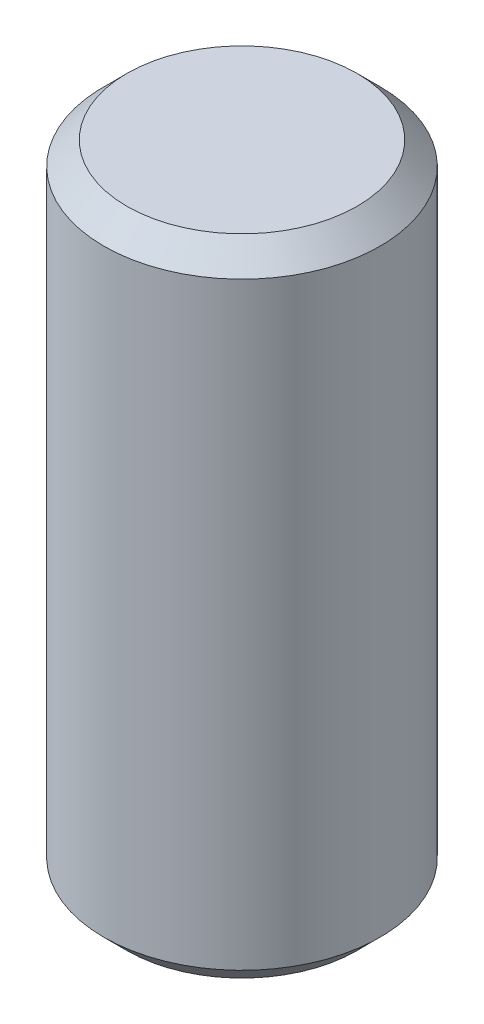
ISO-10303-21;
HEADER;
FILE_DESCRIPTION(('STEP AP214'),'2;1');
FILE_NAME('part.step','',(''),(''),'','','');
FILE_SCHEMA(('AUTOMOTIVE_DESIGN { 1 0 10303 214 1 1 1 1 }'));
ENDSEC;
DATA;
#1=APPLICATION_CONTEXT('core data for automotive mechanical design processes');
#2=APPLICATION_PROTOCOL_DEFINITION('international standard','automotive_design',2000,#1);
#3=PRODUCT_CONTEXT('',#1,'mechanical');
#4=PRODUCT('Part','Part','',(#3));
#5=PRODUCT_RELATED_PRODUCT_CATEGORY('part','',(#4));
#6=PRODUCT_DEFINITION_FORMATION('','',#4);
#7=PRODUCT_DEFINITION_CONTEXT('part definition',#1,'design');
#8=PRODUCT_DEFINITION('design','',#6,#7);
#9=PRODUCT_DEFINITION_SHAPE('','',#8);
#10=(LENGTH_UNIT() NAMED_UNIT(*) SI_UNIT(.MILLI.,.METRE.));
#11=(NAMED_UNIT(*) PLANE_ANGLE_UNIT() SI_UNIT($,.RADIAN.));
#12=(NAMED_UNIT(*) SI_UNIT($,.STERADIAN.) SOLID_ANGLE_UNIT());
#13=UNCERTAINTY_MEASURE_WITH_UNIT(LENGTH_MEASURE(1.E-05),#10,'distance_accuracy_value','');
#14=(GEOMETRIC_REPRESENTATION_CONTEXT(3) GLOBAL_UNCERTAINTY_ASSIGNED_CONTEXT((#13)) GLOBAL_UNIT_ASSIGNED_CONTEXT((#10,
#11,#12)) REPRESENTATION_CONTEXT('',''));
#15=CARTESIAN_POINT('',(0.,0.,0.));
#16=DIRECTION('',(0.,0.,1.));
#17=DIRECTION('',(1.,0.,0.));
#18=AXIS2_PLACEMENT_3D('',#15,#16,#17);
#19=CARTESIAN_POINT('',(0.,-2.825,0.));
#20=DIRECTION('',(0.,-1.,0.));
#21=DIRECTION('',(0.,0.,-1.));
#22=AXIS2_PLACEMENT_3D('',#19,#20,#21);
#23=SPHERICAL_SURFACE('',#22,1.);
#24=CARTESIAN_POINT('',(0.,-3.825,0.));
#25=VERTEX_POINT('',#24);
#26=VERTEX_LOOP('',#25);
#27=FACE_BOUND('',#26,.T.);
#28=ADVANCED_FACE('F36',(#27),#23,.T.);
#29=CLOSED_SHELL('',(#28));
#30=MANIFOLD_SOLID_BREP('B2',#29);
#31=CARTESIAN_POINT('',(0.,-2.50833333333333,1.));
#32=DIRECTION('',(0.,-1.,0.));
#33=DIRECTION('',(0.,0.,-1.));
#34=AXIS2_PLACEMENT_3D('',#31,#32,#33);
#35=PLANE('',#34);
#36=CARTESIAN_POINT('',(0.,-2.50833333333333,0.));
#37=DIRECTION('',(0.,1.,0.));
#38=DIRECTION('',(0.,0.,1.));
#39=AXIS2_PLACEMENT_3D('',#36,#37,#38);
#40=CIRCLE('',#39,1.);
#41=CARTESIAN_POINT('',(0.,-2.50833333333333,1.));
#42=VERTEX_POINT('',#41);
#43=EDGE_CURVE('E35',#42,#42,#40,.T.);
#44=ORIENTED_EDGE('',*,*,#43,.F.);
#45=EDGE_LOOP('',(#44));
#46=FACE_BOUND('',#45,.T.);
#47=ADVANCED_FACE('F48',(#46),#35,.T.);
#48=CARTESIAN_POINT('',(0.,3.825,0.));
#49=DIRECTION('',(0.,1.,0.));
#50=DIRECTION('',(0.,0.,1.));
#51=AXIS2_PLACEMENT_3D('',#48,#49,#50);
#52=CYLINDRICAL_SURFACE('',#51,1.);
#53=ORIENTED_EDGE('',*,*,#43,.T.);
#54=EDGE_LOOP('',(#53));
#55=FACE_BOUND('',#54,.T.);
#56=CARTESIAN_POINT('',(0.,-3.175,0.));
#57=DIRECTION('',(0.,1.,0.));
#58=DIRECTION('',(0.,0.,1.));
#59=AXIS2_PLACEMENT_3D('',#56,#57,#58);
#60=CIRCLE('',#59,1.);
#61=CARTESIAN_POINT('',(0.,-3.175,1.));
#62=VERTEX_POINT('',#61);
#63=EDGE_CURVE('E54',#62,#62,#60,.T.);
#64=ORIENTED_EDGE('',*,*,#63,.F.);
#65=EDGE_LOOP('',(#64));
#66=FACE_BOUND('',#65,.T.);
#67=ADVANCED_FACE('F90',(#55,#66),#52,.F.);
#68=CARTESIAN_POINT('',(0.,-3.175,1.25));
#69=DIRECTION('',(0.,-1.,0.));
#70=DIRECTION('',(0.,0.,-1.));
#71=AXIS2_PLACEMENT_3D('',#68,#69,#70);
#72=PLANE('',#71);
#73=ORIENTED_EDGE('',*,*,#63,.T.);
#74=EDGE_LOOP('',(#73));
#75=FACE_BOUND('',#74,.T.);
#76=CARTESIAN_POINT('',(0.,-3.175,0.));
#77=DIRECTION('',(0.,1.,0.));
#78=DIRECTION('',(0.,0.,1.));
#79=AXIS2_PLACEMENT_3D('',#76,#77,#78);
#80=CIRCLE('',#79,1.25);
#81=CARTESIAN_POINT('',(0.,-3.175,1.25));
#82=VERTEX_POINT('',#81);
#83=EDGE_CURVE('E58',#82,#82,#80,.T.);
#84=ORIENTED_EDGE('',*,*,#83,.F.);
#85=EDGE_LOOP('',(#84));
#86=FACE_BOUND('',#85,.T.);
#87=ADVANCED_FACE('F95',(#75,#86),#72,.T.);
#88=CARTESIAN_POINT('',(0.,-2.925,0.));
#89=DIRECTION('',(0.,1.,0.));
#90=DIRECTION('',(0.,0.,1.));
#91=AXIS2_PLACEMENT_3D('',#88,#89,#90);
#92=CONICAL_SURFACE('',#91,1.5,0.785398163397449);
#93=ORIENTED_EDGE('',*,*,#83,.T.);
#94=EDGE_LOOP('',(#93));
#95=FACE_BOUND('',#94,.T.);
#96=CARTESIAN_POINT('',(0.,-2.925,0.));
#97=DIRECTION('',(0.,1.,0.));
#98=DIRECTION('',(0.,0.,1.));
#99=AXIS2_PLACEMENT_3D('',#96,#97,#98);
#100=CIRCLE('',#99,1.5);
#101=CARTESIAN_POINT('',(0.,-2.925,1.5));
#102=VERTEX_POINT('',#101);
#103=EDGE_CURVE('E62',#102,#102,#100,.T.);
#104=ORIENTED_EDGE('',*,*,#103,.F.);
#105=EDGE_LOOP('',(#104));
#106=FACE_BOUND('',#105,.T.);
#107=ADVANCED_FACE('F86',(#95,#106),#92,.T.);
#108=CARTESIAN_POINT('',(0.,3.825,0.));
#109=DIRECTION('',(0.,1.,0.));
#110=DIRECTION('',(0.,0.,1.));
#111=AXIS2_PLACEMENT_3D('',#108,#109,#110);
#112=CYLINDRICAL_SURFACE('',#111,1.5);
#113=ORIENTED_EDGE('',*,*,#103,.T.);
#114=EDGE_LOOP('',(#113));
#115=FACE_BOUND('',#114,.T.);
#116=CARTESIAN_POINT('',(0.,3.575,0.));
#117=DIRECTION('',(0.,1.,0.));
#118=DIRECTION('',(0.,0.,1.));
#119=AXIS2_PLACEMENT_3D('',#116,#117,#118);
#120=CIRCLE('',#119,1.5);
#121=CARTESIAN_POINT('',(0.,3.575,1.5));
#122=VERTEX_POINT('',#121);
#123=EDGE_CURVE('E67',#122,#122,#120,.T.);
#124=ORIENTED_EDGE('',*,*,#123,.F.);
#125=EDGE_LOOP('',(#124));
#126=FACE_BOUND('',#125,.T.);
#127=ADVANCED_FACE('F78',(#115,#126),#112,.T.);
#128=CARTESIAN_POINT('',(0.,3.825,0.));
#129=DIRECTION('',(0.,-1.,0.));
#130=DIRECTION('',(0.,0.,-1.));
#131=AXIS2_PLACEMENT_3D('',#128,#129,#130);
#132=CONICAL_SURFACE('',#131,1.25,0.78539816339745);
#133=ORIENTED_EDGE('',*,*,#123,.T.);
#134=EDGE_LOOP('',(#133));
#135=FACE_BOUND('',#134,.T.);
#136=CARTESIAN_POINT('',(0.,3.825,0.));
#137=DIRECTION('',(0.,1.,0.));
#138=DIRECTION('',(0.,0.,1.));
#139=AXIS2_PLACEMENT_3D('',#136,#137,#138);
#140=CIRCLE('',#139,1.25);
#141=CARTESIAN_POINT('',(0.,3.825,1.25));
#142=VERTEX_POINT('',#141);
#143=EDGE_CURVE('E70',#142,#142,#140,.T.);
#144=ORIENTED_EDGE('',*,*,#143,.F.);
#145=EDGE_LOOP('',(#144));
#146=FACE_BOUND('',#145,.T.);
#147=ADVANCED_FACE('F76',(#135,#146),#132,.T.);
#148=CARTESIAN_POINT('',(0.,3.825,1.25));
#149=DIRECTION('',(0.,1.,0.));
#150=DIRECTION('',(0.,0.,1.));
#151=AXIS2_PLACEMENT_3D('',#148,#149,#150);
#152=PLANE('',#151);
#153=ORIENTED_EDGE('',*,*,#143,.T.);
#154=EDGE_LOOP('',(#153));
#155=FACE_BOUND('',#154,.T.);
#156=ADVANCED_FACE('F74',(#155),#152,.T.);
#157=CLOSED_SHELL('',(#47,#67,#87,#107,#127,#147,#156));
#158=MANIFOLD_SOLID_BREP('B6',#157);
#159=ADVANCED_BREP_SHAPE_REPRESENTATION('',(#18,#30,#158),#14);
#160=SHAPE_DEFINITION_REPRESENTATION(#9,#159);
ENDSEC;
END-ISO-10303-21;
